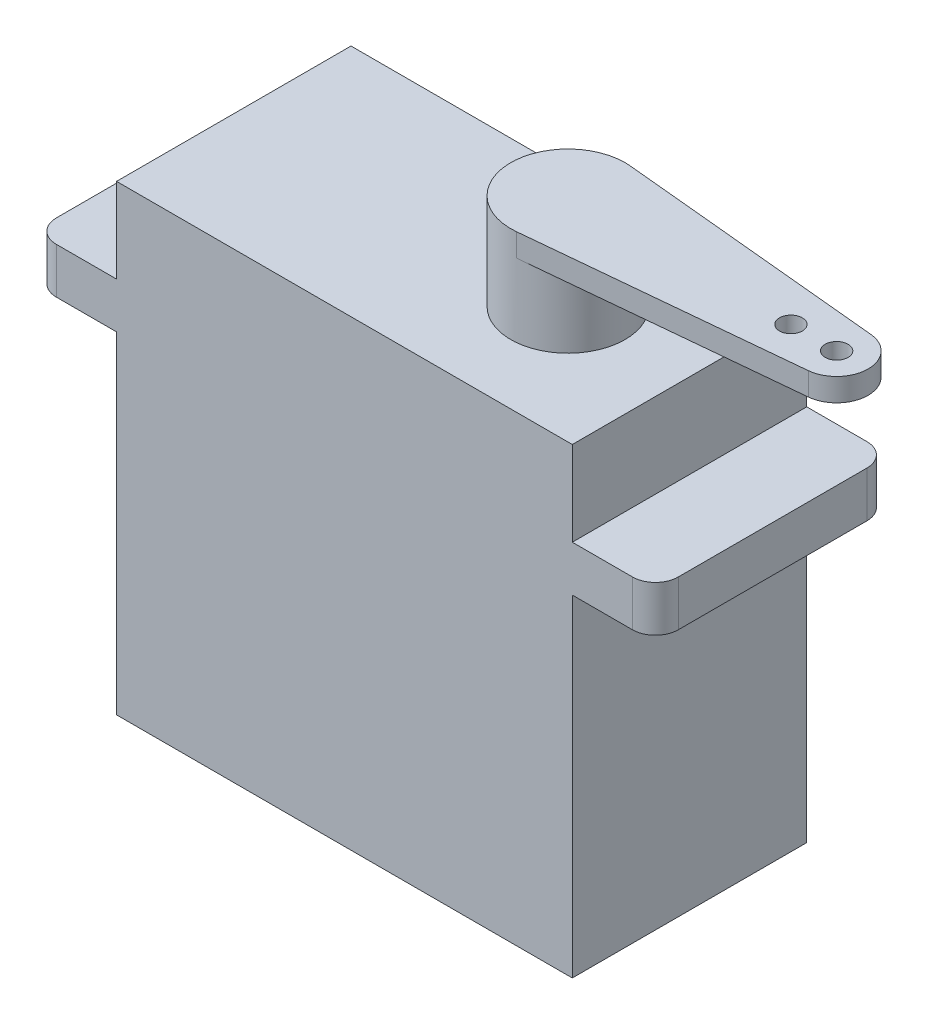
ISO-10303-21;
HEADER;
FILE_DESCRIPTION(('STEP AP214'),'2;1');
FILE_NAME('part.step','',(''),(''),'','','');
FILE_SCHEMA(('AUTOMOTIVE_DESIGN { 1 0 10303 214 1 1 1 1 }'));
ENDSEC;
DATA;
#1=APPLICATION_CONTEXT('core data for automotive mechanical design processes');
#2=APPLICATION_PROTOCOL_DEFINITION('international standard','automotive_design',2000,#1);
#3=PRODUCT_CONTEXT('',#1,'mechanical');
#4=PRODUCT('Part','Part','',(#3));
#5=PRODUCT_RELATED_PRODUCT_CATEGORY('part','',(#4));
#6=PRODUCT_DEFINITION_FORMATION('','',#4);
#7=PRODUCT_DEFINITION_CONTEXT('part definition',#1,'design');
#8=PRODUCT_DEFINITION('design','',#6,#7);
#9=PRODUCT_DEFINITION_SHAPE('','',#8);
#10=(LENGTH_UNIT() NAMED_UNIT(*) SI_UNIT(.MILLI.,.METRE.));
#11=(NAMED_UNIT(*) PLANE_ANGLE_UNIT() SI_UNIT($,.RADIAN.));
#12=(NAMED_UNIT(*) SI_UNIT($,.STERADIAN.) SOLID_ANGLE_UNIT());
#13=UNCERTAINTY_MEASURE_WITH_UNIT(LENGTH_MEASURE(1.E-05),#10,'distance_accuracy_value','');
#14=(GEOMETRIC_REPRESENTATION_CONTEXT(3) GLOBAL_UNCERTAINTY_ASSIGNED_CONTEXT((#13)) GLOBAL_UNIT_ASSIGNED_CONTEXT((#10,
#11,#12)) REPRESENTATION_CONTEXT('',''));
#15=CARTESIAN_POINT('',(0.,0.,0.));
#16=DIRECTION('',(0.,0.,1.));
#17=DIRECTION('',(1.,0.,0.));
#18=AXIS2_PLACEMENT_3D('',#15,#16,#17);
#19=CARTESIAN_POINT('',(0.,40.4,0.));
#20=DIRECTION('',(1.,0.,0.));
#21=DIRECTION('',(0.,0.,-1.));
#22=AXIS2_PLACEMENT_3D('',#19,#20,#21);
#23=PLANE('',#22);
#24=DIRECTION('',(0.,0.,-1.));
#25=VECTOR('',#24,1.);
#26=CARTESIAN_POINT('',(0.,33.,0.));
#27=LINE('',#26,#25);
#28=CARTESIAN_POINT('',(0.,33.,0.));
#29=VERTEX_POINT('',#28);
#30=CARTESIAN_POINT('',(0.,33.,-20.5));
#31=VERTEX_POINT('',#30);
#32=EDGE_CURVE('E245',#29,#31,#27,.T.);
#33=ORIENTED_EDGE('',*,*,#32,.F.);
#34=DIRECTION('',(0.,-1.,0.));
#35=VECTOR('',#34,1.);
#36=CARTESIAN_POINT('',(0.,40.4,0.));
#37=LINE('',#36,#35);
#38=CARTESIAN_POINT('',(0.,40.4,0.));
#39=VERTEX_POINT('',#38);
#40=EDGE_CURVE('E281',#39,#29,#37,.T.);
#41=ORIENTED_EDGE('',*,*,#40,.F.);
#42=DIRECTION('',(0.,0.,1.));
#43=VECTOR('',#42,1.);
#44=CARTESIAN_POINT('',(0.,40.4,0.));
#45=LINE('',#44,#43);
#46=CARTESIAN_POINT('',(0.,40.4,-20.5));
#47=VERTEX_POINT('',#46);
#48=EDGE_CURVE('E248',#47,#39,#45,.T.);
#49=ORIENTED_EDGE('',*,*,#48,.F.);
#50=DIRECTION('',(0.,-1.,0.));
#51=VECTOR('',#50,1.);
#52=CARTESIAN_POINT('',(0.,40.4,-20.5));
#53=LINE('',#52,#51);
#54=EDGE_CURVE('E269',#47,#31,#53,.T.);
#55=ORIENTED_EDGE('',*,*,#54,.T.);
#56=EDGE_LOOP('',(#33,#41,#49,#55));
#57=FACE_BOUND('',#56,.T.);
#58=ADVANCED_FACE('F41',(#57),#23,.F.);
#59=CARTESIAN_POINT('',(39.85,40.4,0.));
#60=DIRECTION('',(-1.,0.,0.));
#61=DIRECTION('',(0.,0.,1.));
#62=AXIS2_PLACEMENT_3D('',#59,#60,#61);
#63=PLANE('',#62);
#64=DIRECTION('',(0.,0.,1.));
#65=VECTOR('',#64,1.);
#66=CARTESIAN_POINT('',(39.85,33.,0.));
#67=LINE('',#66,#65);
#68=CARTESIAN_POINT('',(39.85,33.,-20.5));
#69=VERTEX_POINT('',#68);
#70=CARTESIAN_POINT('',(39.85,33.,0.));
#71=VERTEX_POINT('',#70);
#72=EDGE_CURVE('E243',#69,#71,#67,.T.);
#73=ORIENTED_EDGE('',*,*,#72,.F.);
#74=DIRECTION('',(0.,-1.,0.));
#75=VECTOR('',#74,1.);
#76=CARTESIAN_POINT('',(39.85,40.4,-20.5));
#77=LINE('',#76,#75);
#78=CARTESIAN_POINT('',(39.85,40.4,-20.5));
#79=VERTEX_POINT('',#78);
#80=EDGE_CURVE('E273',#79,#69,#77,.T.);
#81=ORIENTED_EDGE('',*,*,#80,.F.);
#82=DIRECTION('',(0.,0.,-1.));
#83=VECTOR('',#82,1.);
#84=CARTESIAN_POINT('',(39.85,40.4,0.));
#85=LINE('',#84,#83);
#86=CARTESIAN_POINT('',(39.85,40.4,0.));
#87=VERTEX_POINT('',#86);
#88=EDGE_CURVE('E254',#87,#79,#85,.T.);
#89=ORIENTED_EDGE('',*,*,#88,.F.);
#90=DIRECTION('',(0.,-1.,0.));
#91=VECTOR('',#90,1.);
#92=CARTESIAN_POINT('',(39.85,40.4,0.));
#93=LINE('',#92,#91);
#94=EDGE_CURVE('E277',#87,#71,#93,.T.);
#95=ORIENTED_EDGE('',*,*,#94,.T.);
#96=EDGE_LOOP('',(#73,#81,#89,#95));
#97=FACE_BOUND('',#96,.T.);
#98=ADVANCED_FACE('F345',(#97),#63,.F.);
#99=CARTESIAN_POINT('',(0.,29.,0.));
#100=VERTEX_POINT('',#99);
#101=CARTESIAN_POINT('',(0.,0.,0.));
#102=VERTEX_POINT('',#101);
#103=EDGE_CURVE('E280',#100,#102,#37,.T.);
#104=ORIENTED_EDGE('',*,*,#103,.F.);
#105=DIRECTION('',(0.,0.,-1.));
#106=VECTOR('',#105,1.);
#107=CARTESIAN_POINT('',(0.,29.,0.));
#108=LINE('',#107,#106);
#109=CARTESIAN_POINT('',(0.,29.,-20.5));
#110=VERTEX_POINT('',#109);
#111=EDGE_CURVE('E240',#100,#110,#108,.T.);
#112=ORIENTED_EDGE('',*,*,#111,.T.);
#113=CARTESIAN_POINT('',(0.,0.,-20.5));
#114=VERTEX_POINT('',#113);
#115=EDGE_CURVE('E258',#110,#114,#53,.T.);
#116=ORIENTED_EDGE('',*,*,#115,.T.);
#117=DIRECTION('',(0.,0.,1.));
#118=VECTOR('',#117,1.);
#119=CARTESIAN_POINT('',(0.,0.,0.));
#120=LINE('',#119,#118);
#121=EDGE_CURVE('E247',#114,#102,#120,.T.);
#122=ORIENTED_EDGE('',*,*,#121,.T.);
#123=EDGE_LOOP('',(#104,#112,#116,#122));
#124=FACE_BOUND('',#123,.T.);
#125=ADVANCED_FACE('F370',(#124),#23,.F.);
#126=CARTESIAN_POINT('',(0.,40.4,0.));
#127=DIRECTION('',(0.,0.,-1.));
#128=DIRECTION('',(-1.,0.,0.));
#129=AXIS2_PLACEMENT_3D('',#126,#127,#128);
#130=PLANE('',#129);
#131=DIRECTION('',(1.,0.,0.));
#132=VECTOR('',#131,1.);
#133=CARTESIAN_POINT('',(-7.265,29.,0.));
#134=LINE('',#133,#132);
#135=CARTESIAN_POINT('',(39.85,29.,0.));
#136=VERTEX_POINT('',#135);
#137=CARTESIAN_POINT('',(45.115,29.,0.));
#138=VERTEX_POINT('',#137);
#139=EDGE_CURVE('E230',#136,#138,#134,.T.);
#140=ORIENTED_EDGE('',*,*,#139,.T.);
#141=DIRECTION('',(0.,-1.,0.));
#142=VECTOR('',#141,1.);
#143=CARTESIAN_POINT('',(45.115,40.4,0.));
#144=LINE('',#143,#142);
#145=CARTESIAN_POINT('',(45.115,33.,0.));
#146=VERTEX_POINT('',#145);
#147=EDGE_CURVE('E305',#138,#146,#144,.F.);
#148=ORIENTED_EDGE('',*,*,#147,.T.);
#149=DIRECTION('',(1.,0.,0.));
#150=VECTOR('',#149,1.);
#151=CARTESIAN_POINT('',(-7.265,33.,0.));
#152=LINE('',#151,#150);
#153=EDGE_CURVE('E218',#71,#146,#152,.T.);
#154=ORIENTED_EDGE('',*,*,#153,.F.);
#155=ORIENTED_EDGE('',*,*,#94,.F.);
#156=DIRECTION('',(1.,0.,0.));
#157=VECTOR('',#156,1.);
#158=CARTESIAN_POINT('',(0.,40.4,0.));
#159=LINE('',#158,#157);
#160=EDGE_CURVE('E251',#39,#87,#159,.T.);
#161=ORIENTED_EDGE('',*,*,#160,.F.);
#162=ORIENTED_EDGE('',*,*,#40,.T.);
#163=CARTESIAN_POINT('',(-5.265,33.,0.));
#164=VERTEX_POINT('',#163);
#165=EDGE_CURVE('E220',#164,#29,#152,.T.);
#166=ORIENTED_EDGE('',*,*,#165,.F.);
#167=DIRECTION('',(0.,-1.,0.));
#168=VECTOR('',#167,1.);
#169=CARTESIAN_POINT('',(-5.265,40.4,0.));
#170=LINE('',#169,#168);
#171=CARTESIAN_POINT('',(-5.265,29.,0.));
#172=VERTEX_POINT('',#171);
#173=EDGE_CURVE('E302',#164,#172,#170,.T.);
#174=ORIENTED_EDGE('',*,*,#173,.T.);
#175=EDGE_CURVE('E231',#172,#100,#134,.T.);
#176=ORIENTED_EDGE('',*,*,#175,.T.);
#177=ORIENTED_EDGE('',*,*,#103,.T.);
#178=DIRECTION('',(1.,0.,0.));
#179=VECTOR('',#178,1.);
#180=CARTESIAN_POINT('',(0.,0.,0.));
#181=LINE('',#180,#179);
#182=CARTESIAN_POINT('',(39.85,0.,0.));
#183=VERTEX_POINT('',#182);
#184=EDGE_CURVE('E261',#102,#183,#181,.T.);
#185=ORIENTED_EDGE('',*,*,#184,.T.);
#186=EDGE_CURVE('E276',#136,#183,#93,.T.);
#187=ORIENTED_EDGE('',*,*,#186,.F.);
#188=EDGE_LOOP('',(#140,#148,#154,#155,#161,#162,#166,#174,#176,#177,#185,#187));
#189=FACE_BOUND('',#188,.T.);
#190=ADVANCED_FACE('F337',(#189),#130,.F.);
#191=CARTESIAN_POINT('',(39.85,29.,-20.5));
#192=VERTEX_POINT('',#191);
#193=CARTESIAN_POINT('',(39.85,0.,-20.5));
#194=VERTEX_POINT('',#193);
#195=EDGE_CURVE('E272',#192,#194,#77,.T.);
#196=ORIENTED_EDGE('',*,*,#195,.F.);
#197=DIRECTION('',(0.,0.,1.));
#198=VECTOR('',#197,1.);
#199=CARTESIAN_POINT('',(39.85,29.,0.));
#200=LINE('',#199,#198);
#201=EDGE_CURVE('E228',#192,#136,#200,.T.);
#202=ORIENTED_EDGE('',*,*,#201,.T.);
#203=ORIENTED_EDGE('',*,*,#186,.T.);
#204=DIRECTION('',(0.,0.,-1.));
#205=VECTOR('',#204,1.);
#206=CARTESIAN_POINT('',(39.85,0.,0.));
#207=LINE('',#206,#205);
#208=EDGE_CURVE('E264',#183,#194,#207,.T.);
#209=ORIENTED_EDGE('',*,*,#208,.T.);
#210=EDGE_LOOP('',(#196,#202,#203,#209));
#211=FACE_BOUND('',#210,.T.);
#212=ADVANCED_FACE('F379',(#211),#63,.F.);
#213=CARTESIAN_POINT('',(0.,40.4,-20.5));
#214=DIRECTION('',(0.,0.,1.));
#215=DIRECTION('',(1.,0.,0.));
#216=AXIS2_PLACEMENT_3D('',#213,#214,#215);
#217=PLANE('',#216);
#218=DIRECTION('',(-1.,0.,0.));
#219=VECTOR('',#218,1.);
#220=CARTESIAN_POINT('',(-7.265,33.,-20.5));
#221=LINE('',#220,#219);
#222=CARTESIAN_POINT('',(45.115,33.,-20.5));
#223=VERTEX_POINT('',#222);
#224=EDGE_CURVE('E226',#223,#69,#221,.T.);
#225=ORIENTED_EDGE('',*,*,#224,.F.);
#226=DIRECTION('',(0.,-1.,0.));
#227=VECTOR('',#226,1.);
#228=CARTESIAN_POINT('',(45.115,40.4,-20.5));
#229=LINE('',#228,#227);
#230=CARTESIAN_POINT('',(45.115,29.,-20.5));
#231=VERTEX_POINT('',#230);
#232=EDGE_CURVE('E286',#223,#231,#229,.T.);
#233=ORIENTED_EDGE('',*,*,#232,.T.);
#234=DIRECTION('',(-1.,0.,0.));
#235=VECTOR('',#234,1.);
#236=CARTESIAN_POINT('',(-7.265,29.,-20.5));
#237=LINE('',#236,#235);
#238=EDGE_CURVE('E219',#231,#192,#237,.T.);
#239=ORIENTED_EDGE('',*,*,#238,.T.);
#240=ORIENTED_EDGE('',*,*,#195,.T.);
#241=DIRECTION('',(-1.,0.,0.));
#242=VECTOR('',#241,1.);
#243=CARTESIAN_POINT('',(0.,0.,-20.5));
#244=LINE('',#243,#242);
#245=EDGE_CURVE('E252',#194,#114,#244,.T.);
#246=ORIENTED_EDGE('',*,*,#245,.T.);
#247=ORIENTED_EDGE('',*,*,#115,.F.);
#248=CARTESIAN_POINT('',(-5.265,29.,-20.5));
#249=VERTEX_POINT('',#248);
#250=EDGE_CURVE('E236',#110,#249,#237,.T.);
#251=ORIENTED_EDGE('',*,*,#250,.T.);
#252=DIRECTION('',(0.,-1.,0.));
#253=VECTOR('',#252,1.);
#254=CARTESIAN_POINT('',(-5.265,40.4,-20.5));
#255=LINE('',#254,#253);
#256=CARTESIAN_POINT('',(-5.265,33.,-20.5));
#257=VERTEX_POINT('',#256);
#258=EDGE_CURVE('E284',#249,#257,#255,.F.);
#259=ORIENTED_EDGE('',*,*,#258,.T.);
#260=EDGE_CURVE('E225',#31,#257,#221,.T.);
#261=ORIENTED_EDGE('',*,*,#260,.F.);
#262=ORIENTED_EDGE('',*,*,#54,.F.);
#263=DIRECTION('',(-1.,0.,0.));
#264=VECTOR('',#263,1.);
#265=CARTESIAN_POINT('',(0.,40.4,-20.5));
#266=LINE('',#265,#264);
#267=EDGE_CURVE('E256',#79,#47,#266,.T.);
#268=ORIENTED_EDGE('',*,*,#267,.F.);
#269=ORIENTED_EDGE('',*,*,#80,.T.);
#270=EDGE_LOOP('',(#225,#233,#239,#240,#246,#247,#251,#259,#261,#262,#268,#269));
#271=FACE_BOUND('',#270,.T.);
#272=ADVANCED_FACE('F325',(#271),#217,.F.);
#273=CARTESIAN_POINT('',(0.,40.4,0.));
#274=DIRECTION('',(0.,-1.,0.));
#275=DIRECTION('',(0.,0.,-1.));
#276=AXIS2_PLACEMENT_3D('',#273,#274,#275);
#277=PLANE('',#276);
#278=CARTESIAN_POINT('',(29.215,40.4,-10.25));
#279=DIRECTION('',(0.,-1.,0.));
#280=DIRECTION('',(0.,0.,-1.));
#281=AXIS2_PLACEMENT_3D('',#278,#279,#280);
#282=CIRCLE('',#281,5.);
#283=CARTESIAN_POINT('',(29.215,40.4,-15.25));
#284=VERTEX_POINT('',#283);
#285=EDGE_CURVE('E49',#284,#284,#282,.F.);
#286=ORIENTED_EDGE('',*,*,#285,.F.);
#287=EDGE_LOOP('',(#286));
#288=FACE_BOUND('',#287,.T.);
#289=ORIENTED_EDGE('',*,*,#48,.T.);
#290=ORIENTED_EDGE('',*,*,#160,.T.);
#291=ORIENTED_EDGE('',*,*,#88,.T.);
#292=ORIENTED_EDGE('',*,*,#267,.T.);
#293=EDGE_LOOP('',(#289,#290,#291,#292));
#294=FACE_BOUND('',#293,.T.);
#295=ADVANCED_FACE('F321',(#288,#294),#277,.F.);
#296=CARTESIAN_POINT('',(0.,0.,0.));
#297=DIRECTION('',(0.,-1.,0.));
#298=DIRECTION('',(0.,0.,-1.));
#299=AXIS2_PLACEMENT_3D('',#296,#297,#298);
#300=PLANE('',#299);
#301=ORIENTED_EDGE('',*,*,#121,.F.);
#302=ORIENTED_EDGE('',*,*,#245,.F.);
#303=ORIENTED_EDGE('',*,*,#208,.F.);
#304=ORIENTED_EDGE('',*,*,#184,.F.);
#305=EDGE_LOOP('',(#301,#302,#303,#304));
#306=FACE_BOUND('',#305,.T.);
#307=ADVANCED_FACE('F324',(#306),#300,.T.);
#308=CARTESIAN_POINT('',(47.115,33.,0.));
#309=DIRECTION('',(-1.,0.,0.));
#310=DIRECTION('',(0.,0.,1.));
#311=AXIS2_PLACEMENT_3D('',#308,#309,#310);
#312=PLANE('',#311);
#313=DIRECTION('',(0.,0.,-1.));
#314=VECTOR('',#313,1.);
#315=CARTESIAN_POINT('',(47.115,29.,0.));
#316=LINE('',#315,#314);
#317=CARTESIAN_POINT('',(47.115,29.,-2.));
#318=VERTEX_POINT('',#317);
#319=CARTESIAN_POINT('',(47.115,29.,-18.5));
#320=VERTEX_POINT('',#319);
#321=EDGE_CURVE('E233',#318,#320,#316,.T.);
#322=ORIENTED_EDGE('',*,*,#321,.T.);
#323=DIRECTION('',(0.,-1.,0.));
#324=VECTOR('',#323,1.);
#325=CARTESIAN_POINT('',(47.115,33.,-18.5));
#326=LINE('',#325,#324);
#327=CARTESIAN_POINT('',(47.115,33.,-18.5));
#328=VERTEX_POINT('',#327);
#329=EDGE_CURVE('E296',#320,#328,#326,.F.);
#330=ORIENTED_EDGE('',*,*,#329,.T.);
#331=DIRECTION('',(0.,0.,-1.));
#332=VECTOR('',#331,1.);
#333=CARTESIAN_POINT('',(47.115,33.,0.));
#334=LINE('',#333,#332);
#335=CARTESIAN_POINT('',(47.115,33.,-2.));
#336=VERTEX_POINT('',#335);
#337=EDGE_CURVE('E222',#336,#328,#334,.T.);
#338=ORIENTED_EDGE('',*,*,#337,.F.);
#339=DIRECTION('',(0.,-1.,0.));
#340=VECTOR('',#339,1.);
#341=CARTESIAN_POINT('',(47.115,33.,-2.));
#342=LINE('',#341,#340);
#343=EDGE_CURVE('E293',#336,#318,#342,.T.);
#344=ORIENTED_EDGE('',*,*,#343,.T.);
#345=EDGE_LOOP('',(#322,#330,#338,#344));
#346=FACE_BOUND('',#345,.T.);
#347=ADVANCED_FACE('F391',(#346),#312,.F.);
#348=CARTESIAN_POINT('',(0.,33.,0.));
#349=DIRECTION('',(0.,-1.,0.));
#350=DIRECTION('',(0.,0.,-1.));
#351=AXIS2_PLACEMENT_3D('',#348,#349,#350);
#352=PLANE('',#351);
#353=ORIENTED_EDGE('',*,*,#337,.T.);
#354=CARTESIAN_POINT('',(45.115,33.,-18.5));
#355=DIRECTION('',(0.,-1.,0.));
#356=DIRECTION('',(0.,0.,-1.));
#357=AXIS2_PLACEMENT_3D('',#354,#355,#356);
#358=CIRCLE('',#357,2.);
#359=EDGE_CURVE('E300',#328,#223,#358,.F.);
#360=ORIENTED_EDGE('',*,*,#359,.T.);
#361=ORIENTED_EDGE('',*,*,#224,.T.);
#362=ORIENTED_EDGE('',*,*,#72,.T.);
#363=ORIENTED_EDGE('',*,*,#153,.T.);
#364=CARTESIAN_POINT('',(45.115,33.,-2.));
#365=DIRECTION('',(0.,-1.,0.));
#366=DIRECTION('',(0.,0.,-1.));
#367=AXIS2_PLACEMENT_3D('',#364,#365,#366);
#368=CIRCLE('',#367,2.);
#369=EDGE_CURVE('E298',#146,#336,#368,.F.);
#370=ORIENTED_EDGE('',*,*,#369,.T.);
#371=EDGE_LOOP('',(#353,#360,#361,#362,#363,#370));
#372=FACE_BOUND('',#371,.T.);
#373=ADVANCED_FACE('F395',(#372),#352,.F.);
#374=CARTESIAN_POINT('',(0.,29.,0.));
#375=DIRECTION('',(0.,-1.,0.));
#376=DIRECTION('',(0.,0.,-1.));
#377=AXIS2_PLACEMENT_3D('',#374,#375,#376);
#378=PLANE('',#377);
#379=ORIENTED_EDGE('',*,*,#238,.F.);
#380=CARTESIAN_POINT('',(45.115,29.,-18.5));
#381=DIRECTION('',(0.,-1.,0.));
#382=DIRECTION('',(0.,0.,-1.));
#383=AXIS2_PLACEMENT_3D('',#380,#381,#382);
#384=CIRCLE('',#383,2.);
#385=EDGE_CURVE('E291',#231,#320,#384,.T.);
#386=ORIENTED_EDGE('',*,*,#385,.T.);
#387=ORIENTED_EDGE('',*,*,#321,.F.);
#388=CARTESIAN_POINT('',(45.115,29.,-2.));
#389=DIRECTION('',(0.,-1.,0.));
#390=DIRECTION('',(0.,0.,-1.));
#391=AXIS2_PLACEMENT_3D('',#388,#389,#390);
#392=CIRCLE('',#391,2.);
#393=EDGE_CURVE('E289',#318,#138,#392,.T.);
#394=ORIENTED_EDGE('',*,*,#393,.T.);
#395=ORIENTED_EDGE('',*,*,#139,.F.);
#396=ORIENTED_EDGE('',*,*,#201,.F.);
#397=EDGE_LOOP('',(#379,#386,#387,#394,#395,#396));
#398=FACE_BOUND('',#397,.T.);
#399=ADVANCED_FACE('F383',(#398),#378,.T.);
#400=DIRECTION('',(0.,0.,1.));
#401=VECTOR('',#400,1.);
#402=CARTESIAN_POINT('',(-7.265,33.,0.));
#403=LINE('',#402,#401);
#404=CARTESIAN_POINT('',(-7.265,33.,-18.5));
#405=VERTEX_POINT('',#404);
#406=CARTESIAN_POINT('',(-7.265,33.,-2.));
#407=VERTEX_POINT('',#406);
#408=EDGE_CURVE('E216',#405,#407,#403,.T.);
#409=ORIENTED_EDGE('',*,*,#408,.T.);
#410=CARTESIAN_POINT('',(-5.265,33.,-2.));
#411=DIRECTION('',(0.,-1.,0.));
#412=DIRECTION('',(0.,0.,-1.));
#413=AXIS2_PLACEMENT_3D('',#410,#411,#412);
#414=CIRCLE('',#413,2.);
#415=EDGE_CURVE('E317',#407,#164,#414,.F.);
#416=ORIENTED_EDGE('',*,*,#415,.T.);
#417=ORIENTED_EDGE('',*,*,#165,.T.);
#418=ORIENTED_EDGE('',*,*,#32,.T.);
#419=ORIENTED_EDGE('',*,*,#260,.T.);
#420=CARTESIAN_POINT('',(-5.265,33.,-18.5));
#421=DIRECTION('',(0.,-1.,0.));
#422=DIRECTION('',(0.,0.,-1.));
#423=AXIS2_PLACEMENT_3D('',#420,#421,#422);
#424=CIRCLE('',#423,2.);
#425=EDGE_CURVE('E315',#257,#405,#424,.F.);
#426=ORIENTED_EDGE('',*,*,#425,.T.);
#427=EDGE_LOOP('',(#409,#416,#417,#418,#419,#426));
#428=FACE_BOUND('',#427,.T.);
#429=ADVANCED_FACE('F354',(#428),#352,.F.);
#430=ORIENTED_EDGE('',*,*,#175,.F.);
#431=CARTESIAN_POINT('',(-5.265,29.,-2.));
#432=DIRECTION('',(0.,-1.,0.));
#433=DIRECTION('',(0.,0.,-1.));
#434=AXIS2_PLACEMENT_3D('',#431,#432,#433);
#435=CIRCLE('',#434,2.);
#436=CARTESIAN_POINT('',(-7.265,29.,-2.));
#437=VERTEX_POINT('',#436);
#438=EDGE_CURVE('E309',#172,#437,#435,.T.);
#439=ORIENTED_EDGE('',*,*,#438,.T.);
#440=DIRECTION('',(0.,0.,1.));
#441=VECTOR('',#440,1.);
#442=CARTESIAN_POINT('',(-7.265,29.,0.));
#443=LINE('',#442,#441);
#444=CARTESIAN_POINT('',(-7.265,29.,-18.5));
#445=VERTEX_POINT('',#444);
#446=EDGE_CURVE('E209',#445,#437,#443,.T.);
#447=ORIENTED_EDGE('',*,*,#446,.F.);
#448=CARTESIAN_POINT('',(-5.265,29.,-18.5));
#449=DIRECTION('',(0.,-1.,0.));
#450=DIRECTION('',(0.,0.,-1.));
#451=AXIS2_PLACEMENT_3D('',#448,#449,#450);
#452=CIRCLE('',#451,2.);
#453=EDGE_CURVE('E307',#445,#249,#452,.T.);
#454=ORIENTED_EDGE('',*,*,#453,.T.);
#455=ORIENTED_EDGE('',*,*,#250,.F.);
#456=ORIENTED_EDGE('',*,*,#111,.F.);
#457=EDGE_LOOP('',(#430,#439,#447,#454,#455,#456));
#458=FACE_BOUND('',#457,.T.);
#459=ADVANCED_FACE('F361',(#458),#378,.T.);
#460=CARTESIAN_POINT('',(-7.265,33.,0.));
#461=DIRECTION('',(1.,0.,0.));
#462=DIRECTION('',(0.,0.,-1.));
#463=AXIS2_PLACEMENT_3D('',#460,#461,#462);
#464=PLANE('',#463);
#465=ORIENTED_EDGE('',*,*,#446,.T.);
#466=DIRECTION('',(0.,-1.,0.));
#467=VECTOR('',#466,1.);
#468=CARTESIAN_POINT('',(-7.265,33.,-2.));
#469=LINE('',#468,#467);
#470=EDGE_CURVE('E64',#437,#407,#469,.F.);
#471=ORIENTED_EDGE('',*,*,#470,.T.);
#472=ORIENTED_EDGE('',*,*,#408,.F.);
#473=DIRECTION('',(0.,-1.,0.));
#474=VECTOR('',#473,1.);
#475=CARTESIAN_POINT('',(-7.265,33.,-18.5));
#476=LINE('',#475,#474);
#477=EDGE_CURVE('E311',#405,#445,#476,.T.);
#478=ORIENTED_EDGE('',*,*,#477,.T.);
#479=EDGE_LOOP('',(#465,#471,#472,#478));
#480=FACE_BOUND('',#479,.T.);
#481=ADVANCED_FACE('F358',(#480),#464,.F.);
#482=CARTESIAN_POINT('',(45.115,40.4,-18.5));
#483=DIRECTION('',(0.,-1.,0.));
#484=DIRECTION('',(0.,0.,-1.));
#485=AXIS2_PLACEMENT_3D('',#482,#483,#484);
#486=CYLINDRICAL_SURFACE('',#485,2.);
#487=ORIENTED_EDGE('',*,*,#359,.F.);
#488=ORIENTED_EDGE('',*,*,#329,.F.);
#489=ORIENTED_EDGE('',*,*,#385,.F.);
#490=ORIENTED_EDGE('',*,*,#232,.F.);
#491=EDGE_LOOP('',(#487,#488,#489,#490));
#492=FACE_BOUND('',#491,.T.);
#493=ADVANCED_FACE('F398',(#492),#486,.T.);
#494=CARTESIAN_POINT('',(45.115,33.,-2.));
#495=DIRECTION('',(0.,-1.,0.));
#496=DIRECTION('',(0.,0.,-1.));
#497=AXIS2_PLACEMENT_3D('',#494,#495,#496);
#498=CYLINDRICAL_SURFACE('',#497,2.);
#499=ORIENTED_EDGE('',*,*,#369,.F.);
#500=ORIENTED_EDGE('',*,*,#147,.F.);
#501=ORIENTED_EDGE('',*,*,#393,.F.);
#502=ORIENTED_EDGE('',*,*,#343,.F.);
#503=EDGE_LOOP('',(#499,#500,#501,#502));
#504=FACE_BOUND('',#503,.T.);
#505=ADVANCED_FACE('F388',(#504),#498,.T.);
#506=CARTESIAN_POINT('',(-5.265,40.4,-2.));
#507=DIRECTION('',(0.,-1.,0.));
#508=DIRECTION('',(0.,0.,-1.));
#509=AXIS2_PLACEMENT_3D('',#506,#507,#508);
#510=CYLINDRICAL_SURFACE('',#509,2.);
#511=ORIENTED_EDGE('',*,*,#415,.F.);
#512=ORIENTED_EDGE('',*,*,#470,.F.);
#513=ORIENTED_EDGE('',*,*,#438,.F.);
#514=ORIENTED_EDGE('',*,*,#173,.F.);
#515=EDGE_LOOP('',(#511,#512,#513,#514));
#516=FACE_BOUND('',#515,.T.);
#517=ADVANCED_FACE('F365',(#516),#510,.T.);
#518=CARTESIAN_POINT('',(-5.265,33.,-18.5));
#519=DIRECTION('',(0.,-1.,0.));
#520=DIRECTION('',(0.,0.,-1.));
#521=AXIS2_PLACEMENT_3D('',#518,#519,#520);
#522=CYLINDRICAL_SURFACE('',#521,2.);
#523=ORIENTED_EDGE('',*,*,#425,.F.);
#524=ORIENTED_EDGE('',*,*,#258,.F.);
#525=ORIENTED_EDGE('',*,*,#453,.F.);
#526=ORIENTED_EDGE('',*,*,#477,.F.);
#527=EDGE_LOOP('',(#523,#524,#525,#526));
#528=FACE_BOUND('',#527,.T.);
#529=ADVANCED_FACE('F43',(#528),#522,.T.);
#530=CARTESIAN_POINT('',(29.215,48.8,-10.25));
#531=DIRECTION('',(0.,-1.,0.));
#532=DIRECTION('',(0.,0.,-1.));
#533=AXIS2_PLACEMENT_3D('',#530,#531,#532);
#534=CYLINDRICAL_SURFACE('',#533,5.);
#535=CARTESIAN_POINT('',(29.215,48.8,-10.25));
#536=DIRECTION('',(0.,1.,0.));
#537=DIRECTION('',(0.,0.,1.));
#538=AXIS2_PLACEMENT_3D('',#535,#536,#537);
#539=CIRCLE('',#538,5.);
#540=CARTESIAN_POINT('',(29.6937234042553,48.8,-15.2270296264156));
#541=VERTEX_POINT('',#540);
#542=CARTESIAN_POINT('',(29.6937234042553,48.8,-5.27297037358445));
#543=VERTEX_POINT('',#542);
#544=EDGE_CURVE('E205',#541,#543,#539,.T.);
#545=ORIENTED_EDGE('',*,*,#544,.F.);
#546=DIRECTION('',(0.,1.,0.));
#547=VECTOR('',#546,1.);
#548=CARTESIAN_POINT('',(29.6937234042553,46.8,-15.2270296264156));
#549=LINE('',#548,#547);
#550=CARTESIAN_POINT('',(29.6937234042553,46.8,-15.2270296264156));
#551=VERTEX_POINT('',#550);
#552=EDGE_CURVE('E204',#551,#541,#549,.T.);
#553=ORIENTED_EDGE('',*,*,#552,.F.);
#554=CARTESIAN_POINT('',(29.215,46.8,-10.25));
#555=DIRECTION('',(0.,1.,0.));
#556=DIRECTION('',(0.,0.,1.));
#557=AXIS2_PLACEMENT_3D('',#554,#555,#556);
#558=CIRCLE('',#557,5.);
#559=CARTESIAN_POINT('',(29.6937234042553,46.8,-5.27297037358445));
#560=VERTEX_POINT('',#559);
#561=EDGE_CURVE('E11',#560,#551,#558,.T.);
#562=ORIENTED_EDGE('',*,*,#561,.F.);
#563=DIRECTION('',(0.,1.,0.));
#564=VECTOR('',#563,1.);
#565=CARTESIAN_POINT('',(29.6937234042553,46.8,-5.27297037358445));
#566=LINE('',#565,#564);
#567=EDGE_CURVE('E181',#560,#543,#566,.T.);
#568=ORIENTED_EDGE('',*,*,#567,.T.);
#569=EDGE_LOOP('',(#545,#553,#562,#568));
#570=FACE_BOUND('',#569,.T.);
#571=ORIENTED_EDGE('',*,*,#285,.T.);
#572=EDGE_LOOP('',(#571));
#573=FACE_BOUND('',#572,.T.);
#574=ADVANCED_FACE('F202',(#570,#573),#534,.T.);
#575=CARTESIAN_POINT('',(29.215,48.8,-10.25));
#576=DIRECTION('',(0.,1.,0.));
#577=DIRECTION('',(0.,0.,1.));
#578=AXIS2_PLACEMENT_3D('',#575,#576,#577);
#579=PLANE('',#578);
#580=CARTESIAN_POINT('',(52.715,48.8,-10.25));
#581=DIRECTION('',(0.,1.,0.));
#582=DIRECTION('',(0.,0.,1.));
#583=AXIS2_PLACEMENT_3D('',#580,#581,#582);
#584=CIRCLE('',#583,0.999999999999998);
#585=CARTESIAN_POINT('',(52.715,48.8,-9.25000000000001));
#586=VERTEX_POINT('',#585);
#587=EDGE_CURVE('E465',#586,#586,#584,.T.);
#588=ORIENTED_EDGE('',*,*,#587,.F.);
#589=EDGE_LOOP('',(#588));
#590=FACE_BOUND('',#589,.T.);
#591=CARTESIAN_POINT('',(48.715,48.8,-10.25));
#592=DIRECTION('',(0.,1.,0.));
#593=DIRECTION('',(0.,0.,1.));
#594=AXIS2_PLACEMENT_3D('',#591,#592,#593);
#595=CIRCLE('',#594,0.999999999999998);
#596=CARTESIAN_POINT('',(48.715,48.8,-9.25000000000001));
#597=VERTEX_POINT('',#596);
#598=EDGE_CURVE('E466',#597,#597,#595,.T.);
#599=ORIENTED_EDGE('',*,*,#598,.F.);
#600=EDGE_LOOP('',(#599));
#601=FACE_BOUND('',#600,.T.);
#602=ORIENTED_EDGE('',*,*,#544,.T.);
#603=DIRECTION('',(0.995405925283112,0.,-0.0957446808510637));
#604=VECTOR('',#603,1.);
#605=CARTESIAN_POINT('',(29.6937234042553,48.8,-5.27297037358445));
#606=LINE('',#605,#604);
#607=CARTESIAN_POINT('',(52.9782978723404,48.8,-7.51263370547145));
#608=VERTEX_POINT('',#607);
#609=EDGE_CURVE('E186',#543,#608,#606,.T.);
#610=ORIENTED_EDGE('',*,*,#609,.T.);
#611=CARTESIAN_POINT('',(52.715,48.8,-10.25));
#612=DIRECTION('',(0.,1.,0.));
#613=DIRECTION('',(0.,0.,1.));
#614=AXIS2_PLACEMENT_3D('',#611,#612,#613);
#615=CIRCLE('',#614,2.75);
#616=CARTESIAN_POINT('',(52.9782978723404,48.8,-12.9873662945286));
#617=VERTEX_POINT('',#616);
#618=EDGE_CURVE('E477',#608,#617,#615,.T.);
#619=ORIENTED_EDGE('',*,*,#618,.T.);
#620=DIRECTION('',(-0.995405925283112,0.,-0.0957446808510637));
#621=VECTOR('',#620,1.);
#622=CARTESIAN_POINT('',(29.6937234042553,48.8,-15.2270296264156));
#623=LINE('',#622,#621);
#624=EDGE_CURVE('E56',#617,#541,#623,.T.);
#625=ORIENTED_EDGE('',*,*,#624,.T.);
#626=EDGE_LOOP('',(#602,#610,#619,#625));
#627=FACE_BOUND('',#626,.T.);
#628=ADVANCED_FACE('F434',(#590,#601,#627),#579,.T.);
#629=CARTESIAN_POINT('',(29.215,46.8,-10.25));
#630=DIRECTION('',(0.,1.,0.));
#631=DIRECTION('',(0.,0.,1.));
#632=AXIS2_PLACEMENT_3D('',#629,#630,#631);
#633=PLANE('',#632);
#634=CARTESIAN_POINT('',(52.715,46.8,-10.25));
#635=DIRECTION('',(0.,1.,0.));
#636=DIRECTION('',(0.,0.,1.));
#637=AXIS2_PLACEMENT_3D('',#634,#635,#636);
#638=CIRCLE('',#637,0.999999999999998);
#639=CARTESIAN_POINT('',(52.715,46.8,-9.25000000000001));
#640=VERTEX_POINT('',#639);
#641=EDGE_CURVE('E462',#640,#640,#638,.T.);
#642=ORIENTED_EDGE('',*,*,#641,.T.);
#643=EDGE_LOOP('',(#642));
#644=FACE_BOUND('',#643,.T.);
#645=CARTESIAN_POINT('',(48.715,46.8,-10.25));
#646=DIRECTION('',(0.,1.,0.));
#647=DIRECTION('',(0.,0.,1.));
#648=AXIS2_PLACEMENT_3D('',#645,#646,#647);
#649=CIRCLE('',#648,0.999999999999998);
#650=CARTESIAN_POINT('',(48.715,46.8,-9.25000000000001));
#651=VERTEX_POINT('',#650);
#652=EDGE_CURVE('E470',#651,#651,#649,.T.);
#653=ORIENTED_EDGE('',*,*,#652,.T.);
#654=EDGE_LOOP('',(#653));
#655=FACE_BOUND('',#654,.T.);
#656=DIRECTION('',(0.995405925283112,0.,-0.0957446808510637));
#657=VECTOR('',#656,1.);
#658=CARTESIAN_POINT('',(29.6937234042553,46.8,-5.27297037358445));
#659=LINE('',#658,#657);
#660=CARTESIAN_POINT('',(52.9782978723404,46.8,-7.51263370547145));
#661=VERTEX_POINT('',#660);
#662=EDGE_CURVE('E184',#560,#661,#659,.T.);
#663=ORIENTED_EDGE('',*,*,#662,.F.);
#664=ORIENTED_EDGE('',*,*,#561,.T.);
#665=DIRECTION('',(-0.995405925283112,0.,-0.0957446808510637));
#666=VECTOR('',#665,1.);
#667=CARTESIAN_POINT('',(29.6937234042553,46.8,-15.2270296264156));
#668=LINE('',#667,#666);
#669=CARTESIAN_POINT('',(52.9782978723404,46.8,-12.9873662945286));
#670=VERTEX_POINT('',#669);
#671=EDGE_CURVE('E191',#670,#551,#668,.T.);
#672=ORIENTED_EDGE('',*,*,#671,.F.);
#673=CARTESIAN_POINT('',(52.715,46.8,-10.25));
#674=DIRECTION('',(0.,1.,0.));
#675=DIRECTION('',(0.,0.,1.));
#676=AXIS2_PLACEMENT_3D('',#673,#674,#675);
#677=CIRCLE('',#676,2.75);
#678=EDGE_CURVE('E199',#661,#670,#677,.T.);
#679=ORIENTED_EDGE('',*,*,#678,.F.);
#680=EDGE_LOOP('',(#663,#664,#672,#679));
#681=FACE_BOUND('',#680,.T.);
#682=ADVANCED_FACE('F195',(#644,#655,#681),#633,.F.);
#683=CARTESIAN_POINT('',(29.6937234042553,46.8,-15.2270296264156));
#684=DIRECTION('',(0.0957446808510637,0.,-0.995405925283112));
#685=DIRECTION('',(-0.995405925283112,0.,-0.0957446808510637));
#686=AXIS2_PLACEMENT_3D('',#683,#684,#685);
#687=PLANE('',#686);
#688=ORIENTED_EDGE('',*,*,#624,.F.);
#689=DIRECTION('',(0.,1.,0.));
#690=VECTOR('',#689,1.);
#691=CARTESIAN_POINT('',(52.9782978723404,46.8,-12.9873662945286));
#692=LINE('',#691,#690);
#693=EDGE_CURVE('E207',#670,#617,#692,.T.);
#694=ORIENTED_EDGE('',*,*,#693,.F.);
#695=ORIENTED_EDGE('',*,*,#671,.T.);
#696=ORIENTED_EDGE('',*,*,#552,.T.);
#697=EDGE_LOOP('',(#688,#694,#695,#696));
#698=FACE_BOUND('',#697,.T.);
#699=ADVANCED_FACE('F444',(#698),#687,.T.);
#700=CARTESIAN_POINT('',(52.715,46.8,-10.25));
#701=DIRECTION('',(0.,1.,0.));
#702=DIRECTION('',(0.,0.,1.));
#703=AXIS2_PLACEMENT_3D('',#700,#701,#702);
#704=CYLINDRICAL_SURFACE('',#703,2.75);
#705=ORIENTED_EDGE('',*,*,#618,.F.);
#706=DIRECTION('',(0.,1.,0.));
#707=VECTOR('',#706,1.);
#708=CARTESIAN_POINT('',(52.9782978723404,46.8,-7.51263370547145));
#709=LINE('',#708,#707);
#710=EDGE_CURVE('E190',#661,#608,#709,.T.);
#711=ORIENTED_EDGE('',*,*,#710,.F.);
#712=ORIENTED_EDGE('',*,*,#678,.T.);
#713=ORIENTED_EDGE('',*,*,#693,.T.);
#714=EDGE_LOOP('',(#705,#711,#712,#713));
#715=FACE_BOUND('',#714,.T.);
#716=ADVANCED_FACE('F441',(#715),#704,.T.);
#717=CARTESIAN_POINT('',(29.6937234042553,46.8,-5.27297037358445));
#718=DIRECTION('',(0.0957446808510637,0.,0.995405925283112));
#719=DIRECTION('',(0.995405925283112,0.,-0.0957446808510637));
#720=AXIS2_PLACEMENT_3D('',#717,#718,#719);
#721=PLANE('',#720);
#722=ORIENTED_EDGE('',*,*,#609,.F.);
#723=ORIENTED_EDGE('',*,*,#567,.F.);
#724=ORIENTED_EDGE('',*,*,#662,.T.);
#725=ORIENTED_EDGE('',*,*,#710,.T.);
#726=EDGE_LOOP('',(#722,#723,#724,#725));
#727=FACE_BOUND('',#726,.T.);
#728=ADVANCED_FACE('F183',(#727),#721,.T.);
#729=CARTESIAN_POINT('',(48.715,46.8,-10.25));
#730=DIRECTION('',(0.,1.,0.));
#731=DIRECTION('',(0.,0.,1.));
#732=AXIS2_PLACEMENT_3D('',#729,#730,#731);
#733=CYLINDRICAL_SURFACE('',#732,0.999999999999998);
#734=ORIENTED_EDGE('',*,*,#652,.F.);
#735=EDGE_LOOP('',(#734));
#736=FACE_BOUND('',#735,.T.);
#737=ORIENTED_EDGE('',*,*,#598,.T.);
#738=EDGE_LOOP('',(#737));
#739=FACE_BOUND('',#738,.T.);
#740=ADVANCED_FACE('F440',(#736,#739),#733,.F.);
#741=CARTESIAN_POINT('',(52.715,46.8,-10.25));
#742=DIRECTION('',(0.,1.,0.));
#743=DIRECTION('',(0.,0.,1.));
#744=AXIS2_PLACEMENT_3D('',#741,#742,#743);
#745=CYLINDRICAL_SURFACE('',#744,0.999999999999998);
#746=ORIENTED_EDGE('',*,*,#641,.F.);
#747=EDGE_LOOP('',(#746));
#748=FACE_BOUND('',#747,.T.);
#749=ORIENTED_EDGE('',*,*,#587,.T.);
#750=EDGE_LOOP('',(#749));
#751=FACE_BOUND('',#750,.T.);
#752=ADVANCED_FACE('F453',(#748,#751),#745,.F.);
#753=CLOSED_SHELL('',(#58,#98,#125,#190,#212,#272,#295,#307,#347,#373,#399,#429,#459,#481,#493,
#505,#517,#529,#574,#628,#682,#699,#716,#728,#740,#752));
#754=MANIFOLD_SOLID_BREP('B2',#753);
#755=ADVANCED_BREP_SHAPE_REPRESENTATION('',(#18,#754),#14);
#756=SHAPE_DEFINITION_REPRESENTATION(#9,#755);
ENDSEC;
END-ISO-10303-21;
